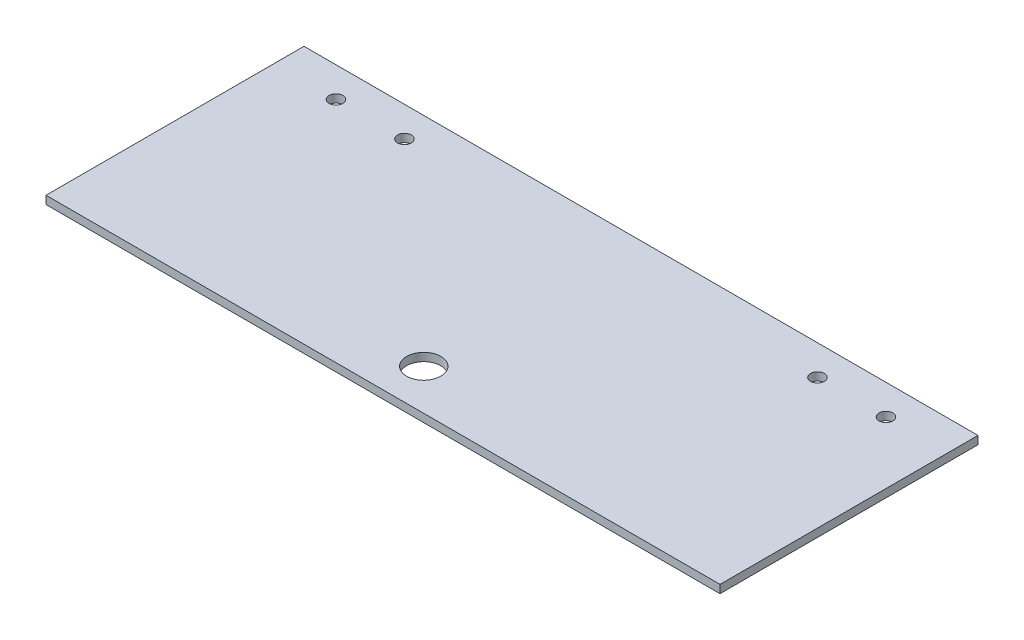
ISO-10303-21;
HEADER;
FILE_DESCRIPTION(('STEP AP214'),'2;1');
FILE_NAME('part.step','',(''),(''),'','','');
FILE_SCHEMA(('AUTOMOTIVE_DESIGN { 1 0 10303 214 1 1 1 1 }'));
ENDSEC;
DATA;
#1=APPLICATION_CONTEXT('core data for automotive mechanical design processes');
#2=APPLICATION_PROTOCOL_DEFINITION('international standard','automotive_design',2000,#1);
#3=PRODUCT_CONTEXT('',#1,'mechanical');
#4=PRODUCT('Part','Part','',(#3));
#5=PRODUCT_RELATED_PRODUCT_CATEGORY('part','',(#4));
#6=PRODUCT_DEFINITION_FORMATION('','',#4);
#7=PRODUCT_DEFINITION_CONTEXT('part definition',#1,'design');
#8=PRODUCT_DEFINITION('design','',#6,#7);
#9=PRODUCT_DEFINITION_SHAPE('','',#8);
#10=(LENGTH_UNIT() NAMED_UNIT(*) SI_UNIT(.MILLI.,.METRE.));
#11=(NAMED_UNIT(*) PLANE_ANGLE_UNIT() SI_UNIT($,.RADIAN.));
#12=(NAMED_UNIT(*) SI_UNIT($,.STERADIAN.) SOLID_ANGLE_UNIT());
#13=UNCERTAINTY_MEASURE_WITH_UNIT(LENGTH_MEASURE(1.E-05),#10,'distance_accuracy_value','');
#14=(GEOMETRIC_REPRESENTATION_CONTEXT(3) GLOBAL_UNCERTAINTY_ASSIGNED_CONTEXT((#13)) GLOBAL_UNIT_ASSIGNED_CONTEXT((#10,
#11,#12)) REPRESENTATION_CONTEXT('',''));
#15=CARTESIAN_POINT('',(0.,0.,0.));
#16=DIRECTION('',(0.,0.,1.));
#17=DIRECTION('',(1.,0.,0.));
#18=AXIS2_PLACEMENT_3D('',#15,#16,#17);
#19=CARTESIAN_POINT('',(0.,3.,0.));
#20=DIRECTION('',(0.,1.,0.));
#21=DIRECTION('',(0.,0.,1.));
#22=AXIS2_PLACEMENT_3D('',#19,#20,#21);
#23=PLANE('',#22);
#24=CARTESIAN_POINT('',(227.,3.,-84.56));
#25=DIRECTION('',(0.,1.,0.));
#26=DIRECTION('',(0.,0.,-1.));
#27=AXIS2_PLACEMENT_3D('',#24,#25,#26);
#28=CIRCLE('',#27,2.56399999999999);
#29=CARTESIAN_POINT('',(227.,3.,-87.124));
#30=VERTEX_POINT('',#29);
#31=EDGE_CURVE('E135',#30,#30,#28,.T.);
#32=ORIENTED_EDGE('',*,*,#31,.F.);
#33=EDGE_LOOP('',(#32));
#34=FACE_BOUND('',#33,.T.);
#35=CARTESIAN_POINT('',(48.4,3.,-84.56));
#36=DIRECTION('',(0.,1.,0.));
#37=DIRECTION('',(0.,0.,1.));
#38=AXIS2_PLACEMENT_3D('',#35,#36,#37);
#39=CIRCLE('',#38,2.56400000000001);
#40=CARTESIAN_POINT('',(48.4,3.,-81.996));
#41=VERTEX_POINT('',#40);
#42=EDGE_CURVE('E123',#41,#41,#39,.T.);
#43=ORIENTED_EDGE('',*,*,#42,.F.);
#44=EDGE_LOOP('',(#43));
#45=FACE_BOUND('',#44,.T.);
#46=DIRECTION('',(0.,0.,1.));
#47=VECTOR('',#46,1.);
#48=CARTESIAN_POINT('',(0.,3.,-95.7));
#49=LINE('',#48,#47);
#50=CARTESIAN_POINT('',(0.,3.,-95.7));
#51=VERTEX_POINT('',#50);
#52=CARTESIAN_POINT('',(0.,3.,0.));
#53=VERTEX_POINT('',#52);
#54=EDGE_CURVE('E93',#51,#53,#49,.T.);
#55=ORIENTED_EDGE('',*,*,#54,.T.);
#56=DIRECTION('',(1.,0.,0.));
#57=VECTOR('',#56,1.);
#58=CARTESIAN_POINT('',(0.,3.,0.));
#59=LINE('',#58,#57);
#60=CARTESIAN_POINT('',(250.,3.,0.));
#61=VERTEX_POINT('',#60);
#62=EDGE_CURVE('E88',#53,#61,#59,.T.);
#63=ORIENTED_EDGE('',*,*,#62,.T.);
#64=DIRECTION('',(0.,0.,-1.));
#65=VECTOR('',#64,1.);
#66=CARTESIAN_POINT('',(250.,3.,-95.7));
#67=LINE('',#66,#65);
#68=CARTESIAN_POINT('',(250.,3.,-95.7));
#69=VERTEX_POINT('',#68);
#70=EDGE_CURVE('E91',#61,#69,#67,.T.);
#71=ORIENTED_EDGE('',*,*,#70,.T.);
#72=DIRECTION('',(-1.,0.,0.));
#73=VECTOR('',#72,1.);
#74=CARTESIAN_POINT('',(0.,3.,-95.7));
#75=LINE('',#74,#73);
#76=EDGE_CURVE('E58',#69,#51,#75,.T.);
#77=ORIENTED_EDGE('',*,*,#76,.T.);
#78=EDGE_LOOP('',(#55,#63,#71,#77));
#79=FACE_BOUND('',#78,.T.);
#80=CARTESIAN_POINT('',(23.,3.,-84.56));
#81=DIRECTION('',(0.,1.,0.));
#82=DIRECTION('',(0.,0.,1.));
#83=AXIS2_PLACEMENT_3D('',#80,#81,#82);
#84=CIRCLE('',#83,2.564);
#85=CARTESIAN_POINT('',(23.,3.,-81.996));
#86=VERTEX_POINT('',#85);
#87=EDGE_CURVE('E108',#86,#86,#84,.T.);
#88=ORIENTED_EDGE('',*,*,#87,.F.);
#89=EDGE_LOOP('',(#88));
#90=FACE_BOUND('',#89,.T.);
#91=CARTESIAN_POINT('',(201.6,3.,-84.56));
#92=DIRECTION('',(0.,1.,0.));
#93=DIRECTION('',(0.,0.,-1.));
#94=AXIS2_PLACEMENT_3D('',#91,#92,#93);
#95=CIRCLE('',#94,2.56400000000002);
#96=CARTESIAN_POINT('',(201.6,3.,-87.124));
#97=VERTEX_POINT('',#96);
#98=EDGE_CURVE('E129',#97,#97,#95,.T.);
#99=ORIENTED_EDGE('',*,*,#98,.F.);
#100=EDGE_LOOP('',(#99));
#101=FACE_BOUND('',#100,.T.);
#102=CARTESIAN_POINT('',(125.,3.,-15.1));
#103=DIRECTION('',(0.,1.,0.));
#104=DIRECTION('',(0.,0.,1.));
#105=AXIS2_PLACEMENT_3D('',#102,#103,#104);
#106=CIRCLE('',#105,6.35);
#107=CARTESIAN_POINT('',(125.,3.,-8.75));
#108=VERTEX_POINT('',#107);
#109=EDGE_CURVE('E141',#108,#108,#106,.T.);
#110=ORIENTED_EDGE('',*,*,#109,.F.);
#111=EDGE_LOOP('',(#110));
#112=FACE_BOUND('',#111,.T.);
#113=ADVANCED_FACE('F41',(#34,#45,#79,#90,#101,#112),#23,.T.);
#114=CARTESIAN_POINT('',(0.,0.,0.));
#115=DIRECTION('',(0.,1.,0.));
#116=DIRECTION('',(0.,0.,1.));
#117=AXIS2_PLACEMENT_3D('',#114,#115,#116);
#118=PLANE('',#117);
#119=DIRECTION('',(0.,0.,1.));
#120=VECTOR('',#119,1.);
#121=CARTESIAN_POINT('',(0.,0.,-95.7));
#122=LINE('',#121,#120);
#123=CARTESIAN_POINT('',(0.,0.,-95.7));
#124=VERTEX_POINT('',#123);
#125=CARTESIAN_POINT('',(0.,0.,0.));
#126=VERTEX_POINT('',#125);
#127=EDGE_CURVE('E105',#124,#126,#122,.T.);
#128=ORIENTED_EDGE('',*,*,#127,.F.);
#129=DIRECTION('',(-1.,0.,0.));
#130=VECTOR('',#129,1.);
#131=CARTESIAN_POINT('',(0.,0.,-95.7));
#132=LINE('',#131,#130);
#133=CARTESIAN_POINT('',(250.,0.,-95.7));
#134=VERTEX_POINT('',#133);
#135=EDGE_CURVE('E81',#134,#124,#132,.T.);
#136=ORIENTED_EDGE('',*,*,#135,.F.);
#137=DIRECTION('',(0.,0.,-1.));
#138=VECTOR('',#137,1.);
#139=CARTESIAN_POINT('',(250.,0.,-95.7));
#140=LINE('',#139,#138);
#141=CARTESIAN_POINT('',(250.,0.,0.));
#142=VERTEX_POINT('',#141);
#143=EDGE_CURVE('E75',#142,#134,#140,.T.);
#144=ORIENTED_EDGE('',*,*,#143,.F.);
#145=DIRECTION('',(1.,0.,0.));
#146=VECTOR('',#145,1.);
#147=CARTESIAN_POINT('',(0.,0.,0.));
#148=LINE('',#147,#146);
#149=EDGE_CURVE('E97',#126,#142,#148,.T.);
#150=ORIENTED_EDGE('',*,*,#149,.F.);
#151=EDGE_LOOP('',(#128,#136,#144,#150));
#152=FACE_BOUND('',#151,.T.);
#153=CARTESIAN_POINT('',(23.,0.,-84.56));
#154=DIRECTION('',(0.,1.,0.));
#155=DIRECTION('',(0.,0.,1.));
#156=AXIS2_PLACEMENT_3D('',#153,#154,#155);
#157=CIRCLE('',#156,2.564);
#158=CARTESIAN_POINT('',(23.,0.,-81.996));
#159=VERTEX_POINT('',#158);
#160=EDGE_CURVE('E120',#159,#159,#157,.T.);
#161=ORIENTED_EDGE('',*,*,#160,.T.);
#162=EDGE_LOOP('',(#161));
#163=FACE_BOUND('',#162,.T.);
#164=CARTESIAN_POINT('',(48.4,0.,-84.56));
#165=DIRECTION('',(0.,1.,0.));
#166=DIRECTION('',(0.,0.,1.));
#167=AXIS2_PLACEMENT_3D('',#164,#165,#166);
#168=CIRCLE('',#167,2.56400000000001);
#169=CARTESIAN_POINT('',(48.4,0.,-81.996));
#170=VERTEX_POINT('',#169);
#171=EDGE_CURVE('E126',#170,#170,#168,.T.);
#172=ORIENTED_EDGE('',*,*,#171,.T.);
#173=EDGE_LOOP('',(#172));
#174=FACE_BOUND('',#173,.T.);
#175=CARTESIAN_POINT('',(201.6,0.,-84.56));
#176=DIRECTION('',(0.,1.,0.));
#177=DIRECTION('',(0.,0.,-1.));
#178=AXIS2_PLACEMENT_3D('',#175,#176,#177);
#179=CIRCLE('',#178,2.56400000000002);
#180=CARTESIAN_POINT('',(201.6,0.,-87.124));
#181=VERTEX_POINT('',#180);
#182=EDGE_CURVE('E132',#181,#181,#179,.T.);
#183=ORIENTED_EDGE('',*,*,#182,.T.);
#184=EDGE_LOOP('',(#183));
#185=FACE_BOUND('',#184,.T.);
#186=CARTESIAN_POINT('',(227.,0.,-84.56));
#187=DIRECTION('',(0.,1.,0.));
#188=DIRECTION('',(0.,0.,-1.));
#189=AXIS2_PLACEMENT_3D('',#186,#187,#188);
#190=CIRCLE('',#189,2.56399999999999);
#191=CARTESIAN_POINT('',(227.,0.,-87.124));
#192=VERTEX_POINT('',#191);
#193=EDGE_CURVE('E138',#192,#192,#190,.T.);
#194=ORIENTED_EDGE('',*,*,#193,.T.);
#195=EDGE_LOOP('',(#194));
#196=FACE_BOUND('',#195,.T.);
#197=CARTESIAN_POINT('',(125.,0.,-15.1));
#198=DIRECTION('',(0.,1.,0.));
#199=DIRECTION('',(0.,0.,1.));
#200=AXIS2_PLACEMENT_3D('',#197,#198,#199);
#201=CIRCLE('',#200,6.35);
#202=CARTESIAN_POINT('',(125.,0.,-8.75));
#203=VERTEX_POINT('',#202);
#204=EDGE_CURVE('E144',#203,#203,#201,.T.);
#205=ORIENTED_EDGE('',*,*,#204,.T.);
#206=EDGE_LOOP('',(#205));
#207=FACE_BOUND('',#206,.T.);
#208=ADVANCED_FACE('F116',(#152,#163,#174,#185,#196,#207),#118,.F.);
#209=CARTESIAN_POINT('',(0.,3.,-95.7));
#210=DIRECTION('',(1.,0.,0.));
#211=DIRECTION('',(0.,0.,-1.));
#212=AXIS2_PLACEMENT_3D('',#209,#210,#211);
#213=PLANE('',#212);
#214=ORIENTED_EDGE('',*,*,#127,.T.);
#215=DIRECTION('',(0.,-1.,0.));
#216=VECTOR('',#215,1.);
#217=CARTESIAN_POINT('',(0.,3.,0.));
#218=LINE('',#217,#216);
#219=EDGE_CURVE('E11',#53,#126,#218,.T.);
#220=ORIENTED_EDGE('',*,*,#219,.F.);
#221=ORIENTED_EDGE('',*,*,#54,.F.);
#222=DIRECTION('',(0.,-1.,0.));
#223=VECTOR('',#222,1.);
#224=CARTESIAN_POINT('',(0.,3.,-95.7));
#225=LINE('',#224,#223);
#226=EDGE_CURVE('E101',#51,#124,#225,.T.);
#227=ORIENTED_EDGE('',*,*,#226,.T.);
#228=EDGE_LOOP('',(#214,#220,#221,#227));
#229=FACE_BOUND('',#228,.T.);
#230=ADVANCED_FACE('F43',(#229),#213,.F.);
#231=CARTESIAN_POINT('',(0.,3.,0.));
#232=DIRECTION('',(0.,0.,-1.));
#233=DIRECTION('',(-1.,0.,0.));
#234=AXIS2_PLACEMENT_3D('',#231,#232,#233);
#235=PLANE('',#234);
#236=ORIENTED_EDGE('',*,*,#149,.T.);
#237=DIRECTION('',(0.,-1.,0.));
#238=VECTOR('',#237,1.);
#239=CARTESIAN_POINT('',(250.,3.,0.));
#240=LINE('',#239,#238);
#241=EDGE_CURVE('E50',#61,#142,#240,.T.);
#242=ORIENTED_EDGE('',*,*,#241,.F.);
#243=ORIENTED_EDGE('',*,*,#62,.F.);
#244=ORIENTED_EDGE('',*,*,#219,.T.);
#245=EDGE_LOOP('',(#236,#242,#243,#244));
#246=FACE_BOUND('',#245,.T.);
#247=ADVANCED_FACE('F96',(#246),#235,.F.);
#248=CARTESIAN_POINT('',(250.,3.,-95.7));
#249=DIRECTION('',(-1.,0.,0.));
#250=DIRECTION('',(0.,0.,1.));
#251=AXIS2_PLACEMENT_3D('',#248,#249,#250);
#252=PLANE('',#251);
#253=ORIENTED_EDGE('',*,*,#143,.T.);
#254=DIRECTION('',(0.,-1.,0.));
#255=VECTOR('',#254,1.);
#256=CARTESIAN_POINT('',(250.,3.,-95.7));
#257=LINE('',#256,#255);
#258=EDGE_CURVE('E98',#69,#134,#257,.T.);
#259=ORIENTED_EDGE('',*,*,#258,.F.);
#260=ORIENTED_EDGE('',*,*,#70,.F.);
#261=ORIENTED_EDGE('',*,*,#241,.T.);
#262=EDGE_LOOP('',(#253,#259,#260,#261));
#263=FACE_BOUND('',#262,.T.);
#264=ADVANCED_FACE('F99',(#263),#252,.F.);
#265=CARTESIAN_POINT('',(0.,3.,-95.7));
#266=DIRECTION('',(0.,0.,1.));
#267=DIRECTION('',(1.,0.,0.));
#268=AXIS2_PLACEMENT_3D('',#265,#266,#267);
#269=PLANE('',#268);
#270=ORIENTED_EDGE('',*,*,#135,.T.);
#271=ORIENTED_EDGE('',*,*,#226,.F.);
#272=ORIENTED_EDGE('',*,*,#76,.F.);
#273=ORIENTED_EDGE('',*,*,#258,.T.);
#274=EDGE_LOOP('',(#270,#271,#272,#273));
#275=FACE_BOUND('',#274,.T.);
#276=ADVANCED_FACE('F113',(#275),#269,.F.);
#277=CARTESIAN_POINT('',(23.,3.,-84.56));
#278=DIRECTION('',(0.,-1.,0.));
#279=DIRECTION('',(0.,0.,-1.));
#280=AXIS2_PLACEMENT_3D('',#277,#278,#279);
#281=CYLINDRICAL_SURFACE('',#280,2.564);
#282=ORIENTED_EDGE('',*,*,#87,.T.);
#283=EDGE_LOOP('',(#282));
#284=FACE_BOUND('',#283,.T.);
#285=ORIENTED_EDGE('',*,*,#160,.F.);
#286=EDGE_LOOP('',(#285));
#287=FACE_BOUND('',#286,.T.);
#288=ADVANCED_FACE('F163',(#284,#287),#281,.F.);
#289=CARTESIAN_POINT('',(48.4,3.,-84.56));
#290=DIRECTION('',(0.,-1.,0.));
#291=DIRECTION('',(0.,0.,-1.));
#292=AXIS2_PLACEMENT_3D('',#289,#290,#291);
#293=CYLINDRICAL_SURFACE('',#292,2.56400000000001);
#294=ORIENTED_EDGE('',*,*,#42,.T.);
#295=EDGE_LOOP('',(#294));
#296=FACE_BOUND('',#295,.T.);
#297=ORIENTED_EDGE('',*,*,#171,.F.);
#298=EDGE_LOOP('',(#297));
#299=FACE_BOUND('',#298,.T.);
#300=ADVANCED_FACE('F208',(#296,#299),#293,.F.);
#301=CARTESIAN_POINT('',(201.6,3.,-84.56));
#302=DIRECTION('',(0.,-1.,0.));
#303=DIRECTION('',(0.,0.,-1.));
#304=AXIS2_PLACEMENT_3D('',#301,#302,#303);
#305=CYLINDRICAL_SURFACE('',#304,2.56400000000002);
#306=ORIENTED_EDGE('',*,*,#98,.T.);
#307=EDGE_LOOP('',(#306));
#308=FACE_BOUND('',#307,.T.);
#309=ORIENTED_EDGE('',*,*,#182,.F.);
#310=EDGE_LOOP('',(#309));
#311=FACE_BOUND('',#310,.T.);
#312=ADVANCED_FACE('F216',(#308,#311),#305,.F.);
#313=CARTESIAN_POINT('',(227.,3.,-84.56));
#314=DIRECTION('',(0.,-1.,0.));
#315=DIRECTION('',(0.,0.,-1.));
#316=AXIS2_PLACEMENT_3D('',#313,#314,#315);
#317=CYLINDRICAL_SURFACE('',#316,2.56399999999999);
#318=ORIENTED_EDGE('',*,*,#31,.T.);
#319=EDGE_LOOP('',(#318));
#320=FACE_BOUND('',#319,.T.);
#321=ORIENTED_EDGE('',*,*,#193,.F.);
#322=EDGE_LOOP('',(#321));
#323=FACE_BOUND('',#322,.T.);
#324=ADVANCED_FACE('F224',(#320,#323),#317,.F.);
#325=CARTESIAN_POINT('',(125.,3.,-15.1));
#326=DIRECTION('',(0.,-1.,0.));
#327=DIRECTION('',(0.,0.,-1.));
#328=AXIS2_PLACEMENT_3D('',#325,#326,#327);
#329=CYLINDRICAL_SURFACE('',#328,6.35);
#330=ORIENTED_EDGE('',*,*,#109,.T.);
#331=EDGE_LOOP('',(#330));
#332=FACE_BOUND('',#331,.T.);
#333=ORIENTED_EDGE('',*,*,#204,.F.);
#334=EDGE_LOOP('',(#333));
#335=FACE_BOUND('',#334,.T.);
#336=ADVANCED_FACE('F150',(#332,#335),#329,.F.);
#337=CLOSED_SHELL('',(#113,#208,#230,#247,#264,#276,#288,#300,#312,#324,#336));
#338=MANIFOLD_SOLID_BREP('B2',#337);
#339=ADVANCED_BREP_SHAPE_REPRESENTATION('',(#18,#338),#14);
#340=SHAPE_DEFINITION_REPRESENTATION(#9,#339);
ENDSEC;
END-ISO-10303-21;
